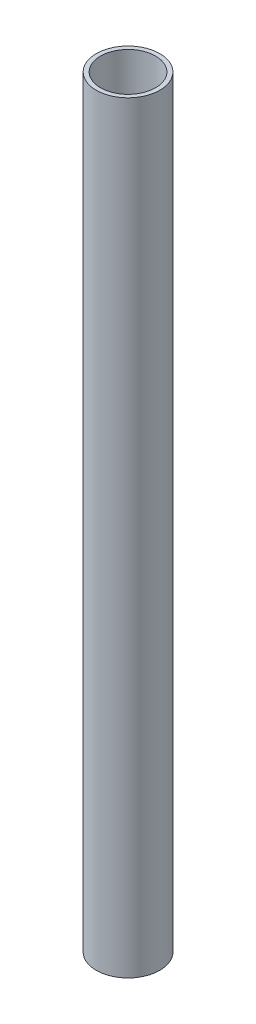
ISO-10303-21;
HEADER;
FILE_DESCRIPTION(('STEP AP214'),'2;1');
FILE_NAME('part.step','',(''),(''),'','','');
FILE_SCHEMA(('AUTOMOTIVE_DESIGN { 1 0 10303 214 1 1 1 1 }'));
ENDSEC;
DATA;
#1=APPLICATION_CONTEXT('core data for automotive mechanical design processes');
#2=APPLICATION_PROTOCOL_DEFINITION('international standard','automotive_design',2000,#1);
#3=PRODUCT_CONTEXT('',#1,'mechanical');
#4=PRODUCT('Part','Part','',(#3));
#5=PRODUCT_RELATED_PRODUCT_CATEGORY('part','',(#4));
#6=PRODUCT_DEFINITION_FORMATION('','',#4);
#7=PRODUCT_DEFINITION_CONTEXT('part definition',#1,'design');
#8=PRODUCT_DEFINITION('design','',#6,#7);
#9=PRODUCT_DEFINITION_SHAPE('','',#8);
#10=(LENGTH_UNIT() NAMED_UNIT(*) SI_UNIT(.MILLI.,.METRE.));
#11=(NAMED_UNIT(*) PLANE_ANGLE_UNIT() SI_UNIT($,.RADIAN.));
#12=(NAMED_UNIT(*) SI_UNIT($,.STERADIAN.) SOLID_ANGLE_UNIT());
#13=UNCERTAINTY_MEASURE_WITH_UNIT(LENGTH_MEASURE(1.E-05),#10,'distance_accuracy_value','');
#14=(GEOMETRIC_REPRESENTATION_CONTEXT(3) GLOBAL_UNCERTAINTY_ASSIGNED_CONTEXT((#13)) GLOBAL_UNIT_ASSIGNED_CONTEXT((#10,
#11,#12)) REPRESENTATION_CONTEXT('',''));
#15=CARTESIAN_POINT('',(0.,0.,0.));
#16=DIRECTION('',(0.,0.,1.));
#17=DIRECTION('',(1.,0.,0.));
#18=AXIS2_PLACEMENT_3D('',#15,#16,#17);
#19=CARTESIAN_POINT('',(0.,180.,0.));
#20=DIRECTION('',(0.,1.,0.));
#21=DIRECTION('',(0.,0.,1.));
#22=AXIS2_PLACEMENT_3D('',#19,#20,#21);
#23=PLANE('',#22);
#24=CARTESIAN_POINT('',(0.,180.,0.));
#25=DIRECTION('',(0.,1.,0.));
#26=DIRECTION('',(0.,0.,1.));
#27=AXIS2_PLACEMENT_3D('',#24,#25,#26);
#28=CIRCLE('',#27,7.5);
#29=CARTESIAN_POINT('',(0.,180.,-7.5));
#30=VERTEX_POINT('',#29);
#31=EDGE_CURVE('E10',#30,#30,#28,.T.);
#32=ORIENTED_EDGE('',*,*,#31,.T.);
#33=EDGE_LOOP('',(#32));
#34=FACE_BOUND('',#33,.T.);
#35=CARTESIAN_POINT('',(0.,180.,0.));
#36=DIRECTION('',(0.,1.,0.));
#37=DIRECTION('',(0.,0.,1.));
#38=AXIS2_PLACEMENT_3D('',#35,#36,#37);
#39=CIRCLE('',#38,6.5);
#40=CARTESIAN_POINT('',(0.,180.,-6.5));
#41=VERTEX_POINT('',#40);
#42=EDGE_CURVE('E42',#41,#41,#39,.T.);
#43=ORIENTED_EDGE('',*,*,#42,.F.);
#44=EDGE_LOOP('',(#43));
#45=FACE_BOUND('',#44,.T.);
#46=ADVANCED_FACE('F31',(#34,#45),#23,.T.);
#47=CARTESIAN_POINT('',(0.,0.,0.));
#48=DIRECTION('',(0.,1.,0.));
#49=DIRECTION('',(0.,0.,1.));
#50=AXIS2_PLACEMENT_3D('',#47,#48,#49);
#51=PLANE('',#50);
#52=CARTESIAN_POINT('',(0.,0.,0.));
#53=DIRECTION('',(0.,1.,0.));
#54=DIRECTION('',(0.,0.,1.));
#55=AXIS2_PLACEMENT_3D('',#52,#53,#54);
#56=CIRCLE('',#55,7.5);
#57=CARTESIAN_POINT('',(0.,0.,-7.5));
#58=VERTEX_POINT('',#57);
#59=EDGE_CURVE('E35',#58,#58,#56,.T.);
#60=ORIENTED_EDGE('',*,*,#59,.F.);
#61=EDGE_LOOP('',(#60));
#62=FACE_BOUND('',#61,.T.);
#63=CARTESIAN_POINT('',(0.,0.,0.));
#64=DIRECTION('',(0.,1.,0.));
#65=DIRECTION('',(0.,0.,1.));
#66=AXIS2_PLACEMENT_3D('',#63,#64,#65);
#67=CIRCLE('',#66,6.5);
#68=CARTESIAN_POINT('',(0.,0.,-6.5));
#69=VERTEX_POINT('',#68);
#70=EDGE_CURVE('E44',#69,#69,#67,.T.);
#71=ORIENTED_EDGE('',*,*,#70,.T.);
#72=EDGE_LOOP('',(#71));
#73=FACE_BOUND('',#72,.T.);
#74=ADVANCED_FACE('F54',(#62,#73),#51,.F.);
#75=CARTESIAN_POINT('',(0.,180.,0.));
#76=DIRECTION('',(0.,-1.,0.));
#77=DIRECTION('',(0.,0.,-1.));
#78=AXIS2_PLACEMENT_3D('',#75,#76,#77);
#79=CYLINDRICAL_SURFACE('',#78,7.5);
#80=CARTESIAN_POINT('',(0.,180.,-7.5));
#81=CARTESIAN_POINT('',(0.,178.125,-7.5));
#82=CARTESIAN_POINT('',(0.,176.25,-7.5));
#83=CARTESIAN_POINT('',(0.,172.5,-7.5));
#84=CARTESIAN_POINT('',(0.,170.625,-7.5));
#85=CARTESIAN_POINT('',(0.,166.875,-7.5));
#86=CARTESIAN_POINT('',(0.,165.,-7.5));
#87=CARTESIAN_POINT('',(0.,161.25,-7.5));
#88=CARTESIAN_POINT('',(0.,159.375,-7.5));
#89=CARTESIAN_POINT('',(0.,155.625,-7.5));
#90=CARTESIAN_POINT('',(0.,153.75,-7.5));
#91=CARTESIAN_POINT('',(0.,150.,-7.5));
#92=CARTESIAN_POINT('',(0.,148.125,-7.5));
#93=CARTESIAN_POINT('',(0.,144.375,-7.5));
#94=CARTESIAN_POINT('',(0.,142.5,-7.5));
#95=CARTESIAN_POINT('',(0.,138.75,-7.5));
#96=CARTESIAN_POINT('',(0.,136.875,-7.5));
#97=CARTESIAN_POINT('',(0.,133.125,-7.5));
#98=CARTESIAN_POINT('',(0.,131.25,-7.5));
#99=CARTESIAN_POINT('',(0.,127.5,-7.5));
#100=CARTESIAN_POINT('',(0.,125.625,-7.5));
#101=CARTESIAN_POINT('',(0.,121.875,-7.5));
#102=CARTESIAN_POINT('',(0.,120.,-7.5));
#103=CARTESIAN_POINT('',(0.,116.25,-7.5));
#104=CARTESIAN_POINT('',(0.,114.375,-7.5));
#105=CARTESIAN_POINT('',(0.,110.625,-7.5));
#106=CARTESIAN_POINT('',(0.,108.75,-7.5));
#107=CARTESIAN_POINT('',(0.,105.,-7.5));
#108=CARTESIAN_POINT('',(0.,103.125,-7.5));
#109=CARTESIAN_POINT('',(0.,99.375,-7.5));
#110=CARTESIAN_POINT('',(0.,97.5,-7.5));
#111=CARTESIAN_POINT('',(0.,93.75,-7.5));
#112=CARTESIAN_POINT('',(0.,91.875,-7.5));
#113=CARTESIAN_POINT('',(0.,88.125,-7.5));
#114=CARTESIAN_POINT('',(0.,86.25,-7.5));
#115=CARTESIAN_POINT('',(0.,82.5,-7.5));
#116=CARTESIAN_POINT('',(0.,80.625,-7.5));
#117=CARTESIAN_POINT('',(0.,76.875,-7.5));
#118=CARTESIAN_POINT('',(0.,75.,-7.5));
#119=CARTESIAN_POINT('',(0.,71.25,-7.5));
#120=CARTESIAN_POINT('',(0.,69.375,-7.5));
#121=CARTESIAN_POINT('',(0.,65.625,-7.5));
#122=CARTESIAN_POINT('',(0.,63.75,-7.5));
#123=CARTESIAN_POINT('',(0.,60.,-7.5));
#124=CARTESIAN_POINT('',(0.,58.125,-7.5));
#125=CARTESIAN_POINT('',(0.,54.375,-7.5));
#126=CARTESIAN_POINT('',(0.,52.5,-7.5));
#127=CARTESIAN_POINT('',(0.,48.75,-7.5));
#128=CARTESIAN_POINT('',(0.,46.875,-7.5));
#129=CARTESIAN_POINT('',(0.,43.125,-7.5));
#130=CARTESIAN_POINT('',(0.,41.25,-7.5));
#131=CARTESIAN_POINT('',(0.,37.5,-7.5));
#132=CARTESIAN_POINT('',(0.,35.625,-7.5));
#133=CARTESIAN_POINT('',(0.,31.875,-7.5));
#134=CARTESIAN_POINT('',(0.,30.,-7.5));
#135=CARTESIAN_POINT('',(0.,26.25,-7.5));
#136=CARTESIAN_POINT('',(0.,24.375,-7.5));
#137=CARTESIAN_POINT('',(0.,20.625,-7.5));
#138=CARTESIAN_POINT('',(0.,18.75,-7.5));
#139=CARTESIAN_POINT('',(0.,15.,-7.5));
#140=CARTESIAN_POINT('',(0.,13.125,-7.5));
#141=CARTESIAN_POINT('',(0.,9.37499999999998,-7.5));
#142=CARTESIAN_POINT('',(0.,7.49999999999997,-7.5));
#143=CARTESIAN_POINT('',(0.,3.74999999999997,-7.5));
#144=CARTESIAN_POINT('',(0.,1.87499999999997,-7.5));
#145=CARTESIAN_POINT('',(0.,0.,-7.5));
#146=B_SPLINE_CURVE_WITH_KNOTS('',3,(#80,#81,#82,#83,#84,#85,#86,#87,#88,#89,#90,#91,#92,#93,
#94,#95,#96,#97,#98,#99,#100,#101,#102,#103,#104,#105,#106,#107,#108,#109,#110,#111,#112,#113,
#114,#115,#116,#117,#118,#119,#120,#121,#122,#123,#124,#125,#126,#127,#128,#129,#130,#131,#132,
#133,#134,#135,#136,#137,#138,#139,#140,#141,#142,#143,#144,#145),.UNSPECIFIED.,.F.,.F.,(4,2,2,
2,2,2,2,2,2,2,2,2,2,2,2,2,2,2,2,2,2,2,2,2,2,2,2,2,2,2,2,2,4),(0.,5.62500000000002,11.25,16.875,
22.5,28.125,33.75,39.375,45.,50.625,56.25,61.875,67.5,73.125,78.75,84.375,90.,95.625,101.25,
106.875,112.5,118.125,123.75,129.375,135.,140.625,146.25,151.875,157.5,163.125,168.75,174.375,
180.),.UNSPECIFIED.);
#147=EDGE_CURVE('BSEAM33',#30,#58,#146,.T.);
#148=ORIENTED_EDGE('',*,*,#31,.F.);
#149=ORIENTED_EDGE('',*,*,#59,.T.);
#150=ORIENTED_EDGE('',*,*,#147,.T.);
#151=ORIENTED_EDGE('',*,*,#147,.F.);
#152=EDGE_LOOP('',(#148,#150,#149,#151));
#153=FACE_BOUND('',#152,.T.);
#154=ADVANCED_FACE('F33',(#153),#79,.T.);
#155=CARTESIAN_POINT('',(0.,180.,0.));
#156=DIRECTION('',(0.,-1.,0.));
#157=DIRECTION('',(0.,0.,-1.));
#158=AXIS2_PLACEMENT_3D('',#155,#156,#157);
#159=CYLINDRICAL_SURFACE('',#158,6.5);
#160=CARTESIAN_POINT('',(0.,180.,-6.5));
#161=CARTESIAN_POINT('',(0.,178.125,-6.5));
#162=CARTESIAN_POINT('',(0.,176.25,-6.5));
#163=CARTESIAN_POINT('',(0.,172.5,-6.5));
#164=CARTESIAN_POINT('',(0.,170.625,-6.5));
#165=CARTESIAN_POINT('',(0.,166.875,-6.5));
#166=CARTESIAN_POINT('',(0.,165.,-6.5));
#167=CARTESIAN_POINT('',(0.,161.25,-6.5));
#168=CARTESIAN_POINT('',(0.,159.375,-6.5));
#169=CARTESIAN_POINT('',(0.,155.625,-6.5));
#170=CARTESIAN_POINT('',(0.,153.75,-6.5));
#171=CARTESIAN_POINT('',(0.,150.,-6.5));
#172=CARTESIAN_POINT('',(0.,148.125,-6.5));
#173=CARTESIAN_POINT('',(0.,144.375,-6.5));
#174=CARTESIAN_POINT('',(0.,142.5,-6.5));
#175=CARTESIAN_POINT('',(0.,138.75,-6.5));
#176=CARTESIAN_POINT('',(0.,136.875,-6.5));
#177=CARTESIAN_POINT('',(0.,133.125,-6.5));
#178=CARTESIAN_POINT('',(0.,131.25,-6.5));
#179=CARTESIAN_POINT('',(0.,127.5,-6.5));
#180=CARTESIAN_POINT('',(0.,125.625,-6.5));
#181=CARTESIAN_POINT('',(0.,121.875,-6.5));
#182=CARTESIAN_POINT('',(0.,120.,-6.5));
#183=CARTESIAN_POINT('',(0.,116.25,-6.5));
#184=CARTESIAN_POINT('',(0.,114.375,-6.5));
#185=CARTESIAN_POINT('',(0.,110.625,-6.5));
#186=CARTESIAN_POINT('',(0.,108.75,-6.5));
#187=CARTESIAN_POINT('',(0.,105.,-6.5));
#188=CARTESIAN_POINT('',(0.,103.125,-6.5));
#189=CARTESIAN_POINT('',(0.,99.375,-6.5));
#190=CARTESIAN_POINT('',(0.,97.5,-6.5));
#191=CARTESIAN_POINT('',(0.,93.75,-6.5));
#192=CARTESIAN_POINT('',(0.,91.875,-6.5));
#193=CARTESIAN_POINT('',(0.,88.125,-6.5));
#194=CARTESIAN_POINT('',(0.,86.25,-6.5));
#195=CARTESIAN_POINT('',(0.,82.5,-6.5));
#196=CARTESIAN_POINT('',(0.,80.625,-6.5));
#197=CARTESIAN_POINT('',(0.,76.875,-6.5));
#198=CARTESIAN_POINT('',(0.,75.,-6.5));
#199=CARTESIAN_POINT('',(0.,71.25,-6.5));
#200=CARTESIAN_POINT('',(0.,69.375,-6.5));
#201=CARTESIAN_POINT('',(0.,65.625,-6.5));
#202=CARTESIAN_POINT('',(0.,63.75,-6.5));
#203=CARTESIAN_POINT('',(0.,60.,-6.5));
#204=CARTESIAN_POINT('',(0.,58.125,-6.5));
#205=CARTESIAN_POINT('',(0.,54.375,-6.5));
#206=CARTESIAN_POINT('',(0.,52.5,-6.5));
#207=CARTESIAN_POINT('',(0.,48.75,-6.5));
#208=CARTESIAN_POINT('',(0.,46.875,-6.5));
#209=CARTESIAN_POINT('',(0.,43.125,-6.5));
#210=CARTESIAN_POINT('',(0.,41.25,-6.5));
#211=CARTESIAN_POINT('',(0.,37.5,-6.5));
#212=CARTESIAN_POINT('',(0.,35.625,-6.5));
#213=CARTESIAN_POINT('',(0.,31.875,-6.5));
#214=CARTESIAN_POINT('',(0.,30.,-6.5));
#215=CARTESIAN_POINT('',(0.,26.25,-6.5));
#216=CARTESIAN_POINT('',(0.,24.375,-6.5));
#217=CARTESIAN_POINT('',(0.,20.625,-6.5));
#218=CARTESIAN_POINT('',(0.,18.75,-6.5));
#219=CARTESIAN_POINT('',(0.,15.,-6.5));
#220=CARTESIAN_POINT('',(0.,13.125,-6.5));
#221=CARTESIAN_POINT('',(0.,9.37499999999998,-6.5));
#222=CARTESIAN_POINT('',(0.,7.49999999999997,-6.5));
#223=CARTESIAN_POINT('',(0.,3.74999999999997,-6.5));
#224=CARTESIAN_POINT('',(0.,1.87499999999997,-6.5));
#225=CARTESIAN_POINT('',(0.,0.,-6.5));
#226=B_SPLINE_CURVE_WITH_KNOTS('',3,(#160,#161,#162,#163,#164,#165,#166,#167,#168,#169,#170,
#171,#172,#173,#174,#175,#176,#177,#178,#179,#180,#181,#182,#183,#184,#185,#186,#187,#188,#189,
#190,#191,#192,#193,#194,#195,#196,#197,#198,#199,#200,#201,#202,#203,#204,#205,#206,#207,#208,
#209,#210,#211,#212,#213,#214,#215,#216,#217,#218,#219,#220,#221,#222,#223,#224,#225),
.UNSPECIFIED.,.F.,.F.,(4,2,2,2,2,2,2,2,2,2,2,2,2,2,2,2,2,2,2,2,2,2,2,2,2,2,2,2,2,2,2,2,4),(0.,
5.62500000000002,11.25,16.875,22.5,28.125,33.75,39.375,45.,50.625,56.25,61.875,67.5,73.125,
78.75,84.375,90.,95.625,101.25,106.875,112.5,118.125,123.75,129.375,135.,140.625,146.25,151.875,
157.5,163.125,168.75,174.375,180.),.UNSPECIFIED.);
#227=EDGE_CURVE('BSEAM50',#41,#69,#226,.T.);
#228=ORIENTED_EDGE('',*,*,#42,.T.);
#229=ORIENTED_EDGE('',*,*,#70,.F.);
#230=ORIENTED_EDGE('',*,*,#227,.T.);
#231=ORIENTED_EDGE('',*,*,#227,.F.);
#232=EDGE_LOOP('',(#228,#230,#229,#231));
#233=FACE_BOUND('',#232,.T.);
#234=ADVANCED_FACE('F50',(#233),#159,.F.);
#235=CLOSED_SHELL('',(#46,#74,#154,#234));
#236=MANIFOLD_SOLID_BREP('B2',#235);
#237=ADVANCED_BREP_SHAPE_REPRESENTATION('',(#18,#236),#14);
#238=SHAPE_DEFINITION_REPRESENTATION(#9,#237);
ENDSEC;
END-ISO-10303-21;
